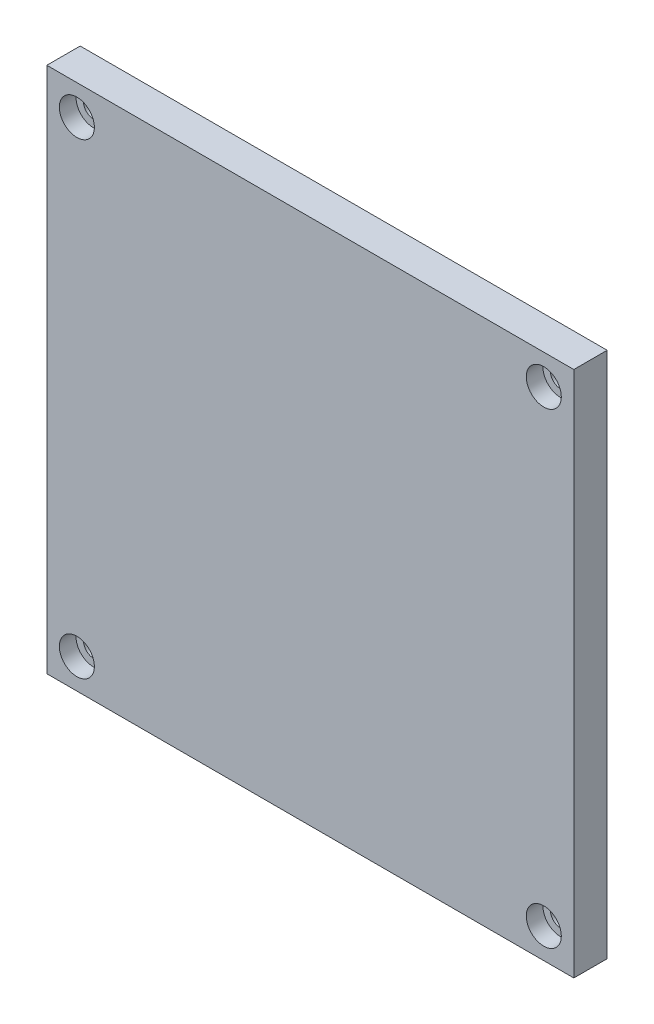
ISO-10303-21;
HEADER;
FILE_DESCRIPTION(('STEP AP214'),'2;1');
FILE_NAME('part.step','',(''),(''),'','','');
FILE_SCHEMA(('AUTOMOTIVE_DESIGN { 1 0 10303 214 1 1 1 1 }'));
ENDSEC;
DATA;
#1=APPLICATION_CONTEXT('core data for automotive mechanical design processes');
#2=APPLICATION_PROTOCOL_DEFINITION('international standard','automotive_design',2000,#1);
#3=PRODUCT_CONTEXT('',#1,'mechanical');
#4=PRODUCT('Part','Part','',(#3));
#5=PRODUCT_RELATED_PRODUCT_CATEGORY('part','',(#4));
#6=PRODUCT_DEFINITION_FORMATION('','',#4);
#7=PRODUCT_DEFINITION_CONTEXT('part definition',#1,'design');
#8=PRODUCT_DEFINITION('design','',#6,#7);
#9=PRODUCT_DEFINITION_SHAPE('','',#8);
#10=(LENGTH_UNIT() NAMED_UNIT(*) SI_UNIT(.MILLI.,.METRE.));
#11=(NAMED_UNIT(*) PLANE_ANGLE_UNIT() SI_UNIT($,.RADIAN.));
#12=(NAMED_UNIT(*) SI_UNIT($,.STERADIAN.) SOLID_ANGLE_UNIT());
#13=UNCERTAINTY_MEASURE_WITH_UNIT(LENGTH_MEASURE(1.E-05),#10,'distance_accuracy_value','');
#14=(GEOMETRIC_REPRESENTATION_CONTEXT(3) GLOBAL_UNCERTAINTY_ASSIGNED_CONTEXT((#13)) GLOBAL_UNIT_ASSIGNED_CONTEXT((#10,
#11,#12)) REPRESENTATION_CONTEXT('',''));
#15=CARTESIAN_POINT('',(0.,0.,0.));
#16=DIRECTION('',(0.,0.,1.));
#17=DIRECTION('',(1.,0.,0.));
#18=AXIS2_PLACEMENT_3D('',#15,#16,#17);
#19=CARTESIAN_POINT('',(0.,0.,0.));
#20=DIRECTION('',(0.,0.,-1.));
#21=DIRECTION('',(-1.,0.,0.));
#22=AXIS2_PLACEMENT_3D('',#19,#20,#21);
#23=PLANE('',#22);
#24=CARTESIAN_POINT('',(24.13,46.99,0.));
#25=DIRECTION('',(0.,0.,1.));
#26=DIRECTION('',(1.,0.,0.));
#27=AXIS2_PLACEMENT_3D('',#24,#25,#26);
#28=CIRCLE('',#27,1.524);
#29=CARTESIAN_POINT('',(25.654,46.99,0.));
#30=VERTEX_POINT('',#29);
#31=EDGE_CURVE('E11',#30,#30,#28,.T.);
#32=ORIENTED_EDGE('',*,*,#31,.T.);
#33=EDGE_LOOP('',(#32));
#34=FACE_BOUND('',#33,.T.);
#35=CARTESIAN_POINT('',(-46.99,-24.13,0.));
#36=DIRECTION('',(0.,0.,1.));
#37=DIRECTION('',(1.,0.,0.));
#38=AXIS2_PLACEMENT_3D('',#35,#36,#37);
#39=CIRCLE('',#38,1.52400000000001);
#40=CARTESIAN_POINT('',(-45.466,-24.13,0.));
#41=VERTEX_POINT('',#40);
#42=EDGE_CURVE('E42',#41,#41,#39,.T.);
#43=ORIENTED_EDGE('',*,*,#42,.T.);
#44=EDGE_LOOP('',(#43));
#45=FACE_BOUND('',#44,.T.);
#46=CARTESIAN_POINT('',(-46.99,46.99,0.));
#47=DIRECTION('',(0.,0.,1.));
#48=DIRECTION('',(1.,0.,0.));
#49=AXIS2_PLACEMENT_3D('',#46,#47,#48);
#50=CIRCLE('',#49,1.52400000000001);
#51=CARTESIAN_POINT('',(-45.466,46.99,0.));
#52=VERTEX_POINT('',#51);
#53=EDGE_CURVE('E135',#52,#52,#50,.T.);
#54=ORIENTED_EDGE('',*,*,#53,.T.);
#55=EDGE_LOOP('',(#54));
#56=FACE_BOUND('',#55,.T.);
#57=CARTESIAN_POINT('',(24.13,-24.13,0.));
#58=DIRECTION('',(0.,0.,1.));
#59=DIRECTION('',(1.,0.,0.));
#60=AXIS2_PLACEMENT_3D('',#57,#58,#59);
#61=CIRCLE('',#60,1.524);
#62=CARTESIAN_POINT('',(25.654,-24.13,0.));
#63=VERTEX_POINT('',#62);
#64=EDGE_CURVE('E138',#63,#63,#61,.T.);
#65=ORIENTED_EDGE('',*,*,#64,.T.);
#66=EDGE_LOOP('',(#65));
#67=FACE_BOUND('',#66,.T.);
#68=DIRECTION('',(1.,0.,0.));
#69=VECTOR('',#68,1.);
#70=CARTESIAN_POINT('',(-51.562,-28.702,0.));
#71=LINE('',#70,#69);
#72=CARTESIAN_POINT('',(-51.562,-28.702,0.));
#73=VERTEX_POINT('',#72);
#74=CARTESIAN_POINT('',(28.702,-28.702,0.));
#75=VERTEX_POINT('',#74);
#76=EDGE_CURVE('E92',#73,#75,#71,.T.);
#77=ORIENTED_EDGE('',*,*,#76,.F.);
#78=DIRECTION('',(0.,-1.,0.));
#79=VECTOR('',#78,1.);
#80=CARTESIAN_POINT('',(-51.562,51.562,0.));
#81=LINE('',#80,#79);
#82=CARTESIAN_POINT('',(-51.562,51.562,0.));
#83=VERTEX_POINT('',#82);
#84=EDGE_CURVE('E50',#83,#73,#81,.T.);
#85=ORIENTED_EDGE('',*,*,#84,.F.);
#86=DIRECTION('',(-1.,0.,0.));
#87=VECTOR('',#86,1.);
#88=CARTESIAN_POINT('',(-51.562,51.562,0.));
#89=LINE('',#88,#87);
#90=CARTESIAN_POINT('',(28.702,51.562,0.));
#91=VERTEX_POINT('',#90);
#92=EDGE_CURVE('E80',#91,#83,#89,.T.);
#93=ORIENTED_EDGE('',*,*,#92,.F.);
#94=DIRECTION('',(0.,1.,0.));
#95=VECTOR('',#94,1.);
#96=CARTESIAN_POINT('',(28.702,51.562,0.));
#97=LINE('',#96,#95);
#98=EDGE_CURVE('E87',#75,#91,#97,.T.);
#99=ORIENTED_EDGE('',*,*,#98,.F.);
#100=EDGE_LOOP('',(#77,#85,#93,#99));
#101=FACE_BOUND('',#100,.T.);
#102=ADVANCED_FACE('F33',(#34,#45,#56,#67,#101),#23,.T.);
#103=CARTESIAN_POINT('',(0.,0.,5.08));
#104=DIRECTION('',(0.,0.,-1.));
#105=DIRECTION('',(0.,-1.,0.));
#106=AXIS2_PLACEMENT_3D('',#103,#104,#105);
#107=PLANE('',#106);
#108=CARTESIAN_POINT('',(-46.99,-24.13,5.08));
#109=DIRECTION('',(0.,0.,1.));
#110=DIRECTION('',(1.,0.,0.));
#111=AXIS2_PLACEMENT_3D('',#108,#109,#110);
#112=CIRCLE('',#111,2.667);
#113=CARTESIAN_POINT('',(-44.323,-24.13,5.08));
#114=VERTEX_POINT('',#113);
#115=EDGE_CURVE('E132',#114,#114,#112,.T.);
#116=ORIENTED_EDGE('',*,*,#115,.F.);
#117=EDGE_LOOP('',(#116));
#118=FACE_BOUND('',#117,.T.);
#119=CARTESIAN_POINT('',(24.13,-24.13,5.08));
#120=DIRECTION('',(0.,0.,1.));
#121=DIRECTION('',(1.,0.,0.));
#122=AXIS2_PLACEMENT_3D('',#119,#120,#121);
#123=CIRCLE('',#122,2.667);
#124=CARTESIAN_POINT('',(26.797,-24.13,5.08));
#125=VERTEX_POINT('',#124);
#126=EDGE_CURVE('E107',#125,#125,#123,.T.);
#127=ORIENTED_EDGE('',*,*,#126,.F.);
#128=EDGE_LOOP('',(#127));
#129=FACE_BOUND('',#128,.T.);
#130=CARTESIAN_POINT('',(24.13,46.99,5.08));
#131=DIRECTION('',(0.,0.,1.));
#132=DIRECTION('',(1.,0.,0.));
#133=AXIS2_PLACEMENT_3D('',#130,#131,#132);
#134=CIRCLE('',#133,2.667);
#135=CARTESIAN_POINT('',(26.797,46.99,5.08));
#136=VERTEX_POINT('',#135);
#137=EDGE_CURVE('E120',#136,#136,#134,.T.);
#138=ORIENTED_EDGE('',*,*,#137,.F.);
#139=EDGE_LOOP('',(#138));
#140=FACE_BOUND('',#139,.T.);
#141=CARTESIAN_POINT('',(-46.99,46.99,5.08));
#142=DIRECTION('',(0.,0.,1.));
#143=DIRECTION('',(1.,0.,0.));
#144=AXIS2_PLACEMENT_3D('',#141,#142,#143);
#145=CIRCLE('',#144,2.667);
#146=CARTESIAN_POINT('',(-44.323,46.99,5.08));
#147=VERTEX_POINT('',#146);
#148=EDGE_CURVE('E114',#147,#147,#145,.T.);
#149=ORIENTED_EDGE('',*,*,#148,.F.);
#150=EDGE_LOOP('',(#149));
#151=FACE_BOUND('',#150,.T.);
#152=DIRECTION('',(0.,-1.,0.));
#153=VECTOR('',#152,1.);
#154=CARTESIAN_POINT('',(-51.562,51.562,5.08));
#155=LINE('',#154,#153);
#156=CARTESIAN_POINT('',(-51.562,51.562,5.08));
#157=VERTEX_POINT('',#156);
#158=CARTESIAN_POINT('',(-51.562,-28.702,5.08));
#159=VERTEX_POINT('',#158);
#160=EDGE_CURVE('E99',#157,#159,#155,.T.);
#161=ORIENTED_EDGE('',*,*,#160,.T.);
#162=DIRECTION('',(1.,0.,0.));
#163=VECTOR('',#162,1.);
#164=CARTESIAN_POINT('',(-51.562,-28.702,5.08));
#165=LINE('',#164,#163);
#166=CARTESIAN_POINT('',(28.702,-28.702,5.08));
#167=VERTEX_POINT('',#166);
#168=EDGE_CURVE('E102',#159,#167,#165,.T.);
#169=ORIENTED_EDGE('',*,*,#168,.T.);
#170=DIRECTION('',(0.,1.,0.));
#171=VECTOR('',#170,1.);
#172=CARTESIAN_POINT('',(28.702,51.562,5.08));
#173=LINE('',#172,#171);
#174=CARTESIAN_POINT('',(28.702,51.562,5.08));
#175=VERTEX_POINT('',#174);
#176=EDGE_CURVE('E58',#167,#175,#173,.T.);
#177=ORIENTED_EDGE('',*,*,#176,.T.);
#178=DIRECTION('',(-1.,0.,0.));
#179=VECTOR('',#178,1.);
#180=CARTESIAN_POINT('',(-51.562,51.562,5.08));
#181=LINE('',#180,#179);
#182=EDGE_CURVE('E82',#175,#157,#181,.T.);
#183=ORIENTED_EDGE('',*,*,#182,.T.);
#184=EDGE_LOOP('',(#161,#169,#177,#183));
#185=FACE_BOUND('',#184,.T.);
#186=ADVANCED_FACE('F35',(#118,#129,#140,#151,#185),#107,.F.);
#187=CARTESIAN_POINT('',(-46.99,46.99,120.027278349685));
#188=DIRECTION('',(0.,0.,-1.));
#189=DIRECTION('',(-1.,0.,0.));
#190=AXIS2_PLACEMENT_3D('',#187,#188,#189);
#191=CYLINDRICAL_SURFACE('',#190,1.52400000000001);
#192=ORIENTED_EDGE('',*,*,#53,.F.);
#193=EDGE_LOOP('',(#192));
#194=FACE_BOUND('',#193,.T.);
#195=CARTESIAN_POINT('',(-46.99,46.99,2.54));
#196=DIRECTION('',(0.,0.,1.));
#197=DIRECTION('',(1.,0.,0.));
#198=AXIS2_PLACEMENT_3D('',#195,#196,#197);
#199=CIRCLE('',#198,1.52400000000001);
#200=CARTESIAN_POINT('',(-45.466,46.99,2.54));
#201=VERTEX_POINT('',#200);
#202=EDGE_CURVE('E37',#201,#201,#199,.T.);
#203=ORIENTED_EDGE('',*,*,#202,.T.);
#204=EDGE_LOOP('',(#203));
#205=FACE_BOUND('',#204,.T.);
#206=ADVANCED_FACE('F153',(#194,#205),#191,.F.);
#207=CARTESIAN_POINT('',(24.13,-24.13,120.027278349685));
#208=DIRECTION('',(0.,0.,-1.));
#209=DIRECTION('',(-1.,0.,0.));
#210=AXIS2_PLACEMENT_3D('',#207,#208,#209);
#211=CYLINDRICAL_SURFACE('',#210,1.524);
#212=ORIENTED_EDGE('',*,*,#64,.F.);
#213=EDGE_LOOP('',(#212));
#214=FACE_BOUND('',#213,.T.);
#215=CARTESIAN_POINT('',(24.13,-24.13,2.54));
#216=DIRECTION('',(0.,0.,1.));
#217=DIRECTION('',(1.,0.,0.));
#218=AXIS2_PLACEMENT_3D('',#215,#216,#217);
#219=CIRCLE('',#218,1.524);
#220=CARTESIAN_POINT('',(25.654,-24.13,2.54));
#221=VERTEX_POINT('',#220);
#222=EDGE_CURVE('E146',#221,#221,#219,.T.);
#223=ORIENTED_EDGE('',*,*,#222,.T.);
#224=EDGE_LOOP('',(#223));
#225=FACE_BOUND('',#224,.T.);
#226=ADVANCED_FACE('F194',(#214,#225),#211,.F.);
#227=CARTESIAN_POINT('',(24.13,46.99,120.027278349685));
#228=DIRECTION('',(0.,0.,-1.));
#229=DIRECTION('',(-1.,0.,0.));
#230=AXIS2_PLACEMENT_3D('',#227,#228,#229);
#231=CYLINDRICAL_SURFACE('',#230,1.524);
#232=ORIENTED_EDGE('',*,*,#31,.F.);
#233=EDGE_LOOP('',(#232));
#234=FACE_BOUND('',#233,.T.);
#235=CARTESIAN_POINT('',(24.13,46.99,2.54));
#236=DIRECTION('',(0.,0.,1.));
#237=DIRECTION('',(1.,0.,0.));
#238=AXIS2_PLACEMENT_3D('',#235,#236,#237);
#239=CIRCLE('',#238,1.524);
#240=CARTESIAN_POINT('',(25.654,46.99,2.54));
#241=VERTEX_POINT('',#240);
#242=EDGE_CURVE('E113',#241,#241,#239,.T.);
#243=ORIENTED_EDGE('',*,*,#242,.T.);
#244=EDGE_LOOP('',(#243));
#245=FACE_BOUND('',#244,.T.);
#246=ADVANCED_FACE('F197',(#234,#245),#231,.F.);
#247=CARTESIAN_POINT('',(-46.99,-24.13,120.027278349685));
#248=DIRECTION('',(0.,0.,-1.));
#249=DIRECTION('',(-1.,0.,0.));
#250=AXIS2_PLACEMENT_3D('',#247,#248,#249);
#251=CYLINDRICAL_SURFACE('',#250,1.52400000000001);
#252=ORIENTED_EDGE('',*,*,#42,.F.);
#253=EDGE_LOOP('',(#252));
#254=FACE_BOUND('',#253,.T.);
#255=CARTESIAN_POINT('',(-46.99,-24.13,2.54));
#256=DIRECTION('',(0.,0.,1.));
#257=DIRECTION('',(1.,0.,0.));
#258=AXIS2_PLACEMENT_3D('',#255,#256,#257);
#259=CIRCLE('',#258,1.52400000000001);
#260=CARTESIAN_POINT('',(-45.466,-24.13,2.54));
#261=VERTEX_POINT('',#260);
#262=EDGE_CURVE('E131',#261,#261,#259,.T.);
#263=ORIENTED_EDGE('',*,*,#262,.T.);
#264=EDGE_LOOP('',(#263));
#265=FACE_BOUND('',#264,.T.);
#266=ADVANCED_FACE('F199',(#254,#265),#251,.F.);
#267=CARTESIAN_POINT('',(-46.99,-24.13,2.54));
#268=DIRECTION('',(0.,0.,1.));
#269=DIRECTION('',(1.,0.,0.));
#270=AXIS2_PLACEMENT_3D('',#267,#268,#269);
#271=CYLINDRICAL_SURFACE('',#270,2.667);
#272=CARTESIAN_POINT('',(-46.99,-24.13,2.54));
#273=DIRECTION('',(0.,0.,1.));
#274=DIRECTION('',(1.,0.,0.));
#275=AXIS2_PLACEMENT_3D('',#272,#273,#274);
#276=CIRCLE('',#275,2.667);
#277=CARTESIAN_POINT('',(-44.323,-24.13,2.54));
#278=VERTEX_POINT('',#277);
#279=EDGE_CURVE('E128',#278,#278,#276,.T.);
#280=ORIENTED_EDGE('',*,*,#279,.F.);
#281=EDGE_LOOP('',(#280));
#282=FACE_BOUND('',#281,.T.);
#283=ORIENTED_EDGE('',*,*,#115,.T.);
#284=EDGE_LOOP('',(#283));
#285=FACE_BOUND('',#284,.T.);
#286=ADVANCED_FACE('F192',(#282,#285),#271,.F.);
#287=CARTESIAN_POINT('',(-46.99,-24.13,2.54));
#288=DIRECTION('',(0.,0.,1.));
#289=DIRECTION('',(1.,0.,0.));
#290=AXIS2_PLACEMENT_3D('',#287,#288,#289);
#291=PLANE('',#290);
#292=ORIENTED_EDGE('',*,*,#262,.F.);
#293=EDGE_LOOP('',(#292));
#294=FACE_BOUND('',#293,.T.);
#295=ORIENTED_EDGE('',*,*,#279,.T.);
#296=EDGE_LOOP('',(#295));
#297=FACE_BOUND('',#296,.T.);
#298=ADVANCED_FACE('F233',(#294,#297),#291,.T.);
#299=CARTESIAN_POINT('',(24.13,-24.13,2.54));
#300=DIRECTION('',(0.,0.,1.));
#301=DIRECTION('',(1.,0.,0.));
#302=AXIS2_PLACEMENT_3D('',#299,#300,#301);
#303=CYLINDRICAL_SURFACE('',#302,2.667);
#304=CARTESIAN_POINT('',(24.13,-24.13,2.54));
#305=DIRECTION('',(0.,0.,1.));
#306=DIRECTION('',(1.,0.,0.));
#307=AXIS2_PLACEMENT_3D('',#304,#305,#306);
#308=CIRCLE('',#307,2.667);
#309=CARTESIAN_POINT('',(26.797,-24.13,2.54));
#310=VERTEX_POINT('',#309);
#311=EDGE_CURVE('E123',#310,#310,#308,.T.);
#312=ORIENTED_EDGE('',*,*,#311,.F.);
#313=EDGE_LOOP('',(#312));
#314=FACE_BOUND('',#313,.T.);
#315=ORIENTED_EDGE('',*,*,#126,.T.);
#316=EDGE_LOOP('',(#315));
#317=FACE_BOUND('',#316,.T.);
#318=ADVANCED_FACE('F228',(#314,#317),#303,.F.);
#319=CARTESIAN_POINT('',(24.13,-24.13,2.54));
#320=DIRECTION('',(0.,0.,1.));
#321=DIRECTION('',(1.,0.,0.));
#322=AXIS2_PLACEMENT_3D('',#319,#320,#321);
#323=PLANE('',#322);
#324=ORIENTED_EDGE('',*,*,#222,.F.);
#325=EDGE_LOOP('',(#324));
#326=FACE_BOUND('',#325,.T.);
#327=ORIENTED_EDGE('',*,*,#311,.T.);
#328=EDGE_LOOP('',(#327));
#329=FACE_BOUND('',#328,.T.);
#330=ADVANCED_FACE('F221',(#326,#329),#323,.T.);
#331=CARTESIAN_POINT('',(24.13,46.99,2.54));
#332=DIRECTION('',(0.,0.,1.));
#333=DIRECTION('',(1.,0.,0.));
#334=AXIS2_PLACEMENT_3D('',#331,#332,#333);
#335=CYLINDRICAL_SURFACE('',#334,2.667);
#336=CARTESIAN_POINT('',(24.13,46.99,2.54));
#337=DIRECTION('',(0.,0.,1.));
#338=DIRECTION('',(1.,0.,0.));
#339=AXIS2_PLACEMENT_3D('',#336,#337,#338);
#340=CIRCLE('',#339,2.667);
#341=CARTESIAN_POINT('',(26.797,46.99,2.54));
#342=VERTEX_POINT('',#341);
#343=EDGE_CURVE('E117',#342,#342,#340,.T.);
#344=ORIENTED_EDGE('',*,*,#343,.F.);
#345=EDGE_LOOP('',(#344));
#346=FACE_BOUND('',#345,.T.);
#347=ORIENTED_EDGE('',*,*,#137,.T.);
#348=EDGE_LOOP('',(#347));
#349=FACE_BOUND('',#348,.T.);
#350=ADVANCED_FACE('F215',(#346,#349),#335,.F.);
#351=CARTESIAN_POINT('',(24.13,46.99,2.54));
#352=DIRECTION('',(0.,0.,1.));
#353=DIRECTION('',(1.,0.,0.));
#354=AXIS2_PLACEMENT_3D('',#351,#352,#353);
#355=PLANE('',#354);
#356=ORIENTED_EDGE('',*,*,#242,.F.);
#357=EDGE_LOOP('',(#356));
#358=FACE_BOUND('',#357,.T.);
#359=ORIENTED_EDGE('',*,*,#343,.T.);
#360=EDGE_LOOP('',(#359));
#361=FACE_BOUND('',#360,.T.);
#362=ADVANCED_FACE('F165',(#358,#361),#355,.T.);
#363=CARTESIAN_POINT('',(-46.99,46.99,2.54));
#364=DIRECTION('',(0.,0.,1.));
#365=DIRECTION('',(1.,0.,0.));
#366=AXIS2_PLACEMENT_3D('',#363,#364,#365);
#367=CYLINDRICAL_SURFACE('',#366,2.667);
#368=CARTESIAN_POINT('',(-46.99,46.99,2.54));
#369=DIRECTION('',(0.,0.,1.));
#370=DIRECTION('',(1.,0.,0.));
#371=AXIS2_PLACEMENT_3D('',#368,#369,#370);
#372=CIRCLE('',#371,2.667);
#373=CARTESIAN_POINT('',(-44.323,46.99,2.54));
#374=VERTEX_POINT('',#373);
#375=EDGE_CURVE('E110',#374,#374,#372,.T.);
#376=ORIENTED_EDGE('',*,*,#375,.F.);
#377=EDGE_LOOP('',(#376));
#378=FACE_BOUND('',#377,.T.);
#379=ORIENTED_EDGE('',*,*,#148,.T.);
#380=EDGE_LOOP('',(#379));
#381=FACE_BOUND('',#380,.T.);
#382=ADVANCED_FACE('F159',(#378,#381),#367,.F.);
#383=CARTESIAN_POINT('',(-46.99,46.99,2.54));
#384=DIRECTION('',(0.,0.,1.));
#385=DIRECTION('',(1.,0.,0.));
#386=AXIS2_PLACEMENT_3D('',#383,#384,#385);
#387=PLANE('',#386);
#388=ORIENTED_EDGE('',*,*,#202,.F.);
#389=EDGE_LOOP('',(#388));
#390=FACE_BOUND('',#389,.T.);
#391=ORIENTED_EDGE('',*,*,#375,.T.);
#392=EDGE_LOOP('',(#391));
#393=FACE_BOUND('',#392,.T.);
#394=ADVANCED_FACE('F155',(#390,#393),#387,.T.);
#395=CARTESIAN_POINT('',(-51.562,51.562,0.));
#396=DIRECTION('',(-1.,0.,0.));
#397=DIRECTION('',(0.,-1.,0.));
#398=AXIS2_PLACEMENT_3D('',#395,#396,#397);
#399=PLANE('',#398);
#400=ORIENTED_EDGE('',*,*,#160,.F.);
#401=DIRECTION('',(0.,0.,1.));
#402=VECTOR('',#401,1.);
#403=CARTESIAN_POINT('',(-51.562,51.562,0.));
#404=LINE('',#403,#402);
#405=EDGE_CURVE('E83',#83,#157,#404,.T.);
#406=ORIENTED_EDGE('',*,*,#405,.F.);
#407=ORIENTED_EDGE('',*,*,#84,.T.);
#408=DIRECTION('',(0.,0.,1.));
#409=VECTOR('',#408,1.);
#410=CARTESIAN_POINT('',(-51.562,-28.702,0.));
#411=LINE('',#410,#409);
#412=EDGE_CURVE('E94',#73,#159,#411,.T.);
#413=ORIENTED_EDGE('',*,*,#412,.T.);
#414=EDGE_LOOP('',(#400,#406,#407,#413));
#415=FACE_BOUND('',#414,.T.);
#416=ADVANCED_FACE('F158',(#415),#399,.T.);
#417=CARTESIAN_POINT('',(-51.562,51.562,0.));
#418=DIRECTION('',(0.,1.,0.));
#419=DIRECTION('',(0.,0.,1.));
#420=AXIS2_PLACEMENT_3D('',#417,#418,#419);
#421=PLANE('',#420);
#422=ORIENTED_EDGE('',*,*,#182,.F.);
#423=DIRECTION('',(0.,0.,1.));
#424=VECTOR('',#423,1.);
#425=CARTESIAN_POINT('',(28.702,51.562,0.));
#426=LINE('',#425,#424);
#427=EDGE_CURVE('E76',#91,#175,#426,.T.);
#428=ORIENTED_EDGE('',*,*,#427,.F.);
#429=ORIENTED_EDGE('',*,*,#92,.T.);
#430=ORIENTED_EDGE('',*,*,#405,.T.);
#431=EDGE_LOOP('',(#422,#428,#429,#430));
#432=FACE_BOUND('',#431,.T.);
#433=ADVANCED_FACE('F78',(#432),#421,.T.);
#434=CARTESIAN_POINT('',(28.702,51.562,0.));
#435=DIRECTION('',(1.,0.,0.));
#436=DIRECTION('',(0.,1.,0.));
#437=AXIS2_PLACEMENT_3D('',#434,#435,#436);
#438=PLANE('',#437);
#439=ORIENTED_EDGE('',*,*,#176,.F.);
#440=DIRECTION('',(0.,0.,1.));
#441=VECTOR('',#440,1.);
#442=CARTESIAN_POINT('',(28.702,-28.702,0.));
#443=LINE('',#442,#441);
#444=EDGE_CURVE('E84',#75,#167,#443,.T.);
#445=ORIENTED_EDGE('',*,*,#444,.F.);
#446=ORIENTED_EDGE('',*,*,#98,.T.);
#447=ORIENTED_EDGE('',*,*,#427,.T.);
#448=EDGE_LOOP('',(#439,#445,#446,#447));
#449=FACE_BOUND('',#448,.T.);
#450=ADVANCED_FACE('F88',(#449),#438,.T.);
#451=CARTESIAN_POINT('',(-51.562,-28.702,0.));
#452=DIRECTION('',(0.,-1.,0.));
#453=DIRECTION('',(0.,0.,-1.));
#454=AXIS2_PLACEMENT_3D('',#451,#452,#453);
#455=PLANE('',#454);
#456=ORIENTED_EDGE('',*,*,#168,.F.);
#457=ORIENTED_EDGE('',*,*,#412,.F.);
#458=ORIENTED_EDGE('',*,*,#76,.T.);
#459=ORIENTED_EDGE('',*,*,#444,.T.);
#460=EDGE_LOOP('',(#456,#457,#458,#459));
#461=FACE_BOUND('',#460,.T.);
#462=ADVANCED_FACE('F175',(#461),#455,.T.);
#463=CLOSED_SHELL('',(#102,#186,#206,#226,#246,#266,#286,#298,#318,#330,#350,#362,#382,#394,
#416,#433,#450,#462));
#464=MANIFOLD_SOLID_BREP('B2',#463);
#465=ADVANCED_BREP_SHAPE_REPRESENTATION('',(#18,#464),#14);
#466=SHAPE_DEFINITION_REPRESENTATION(#9,#465);
ENDSEC;
END-ISO-10303-21;
